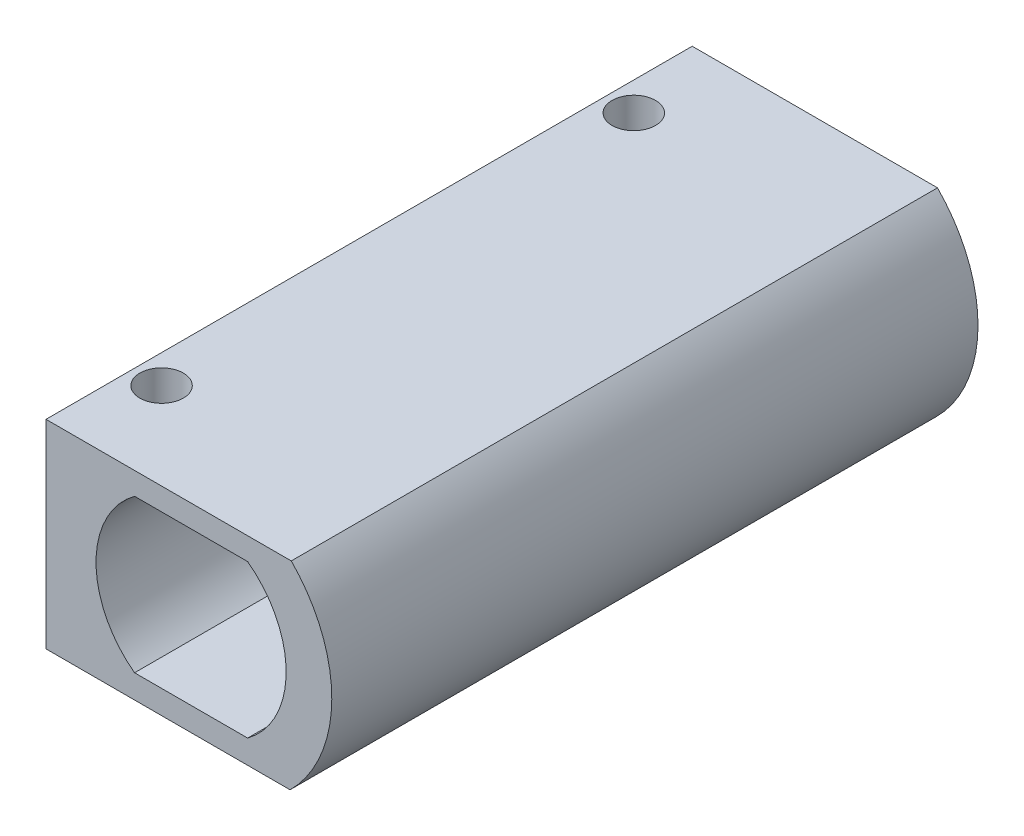
ISO-10303-21;
HEADER;
FILE_DESCRIPTION(('STEP AP214'),'2;1');
FILE_NAME('part.step','',(''),(''),'','','');
FILE_SCHEMA(('AUTOMOTIVE_DESIGN { 1 0 10303 214 1 1 1 1 }'));
ENDSEC;
DATA;
#1=APPLICATION_CONTEXT('core data for automotive mechanical design processes');
#2=APPLICATION_PROTOCOL_DEFINITION('international standard','automotive_design',2000,#1);
#3=PRODUCT_CONTEXT('',#1,'mechanical');
#4=PRODUCT('Part','Part','',(#3));
#5=PRODUCT_RELATED_PRODUCT_CATEGORY('part','',(#4));
#6=PRODUCT_DEFINITION_FORMATION('','',#4);
#7=PRODUCT_DEFINITION_CONTEXT('part definition',#1,'design');
#8=PRODUCT_DEFINITION('design','',#6,#7);
#9=PRODUCT_DEFINITION_SHAPE('','',#8);
#10=(LENGTH_UNIT() NAMED_UNIT(*) SI_UNIT(.MILLI.,.METRE.));
#11=(NAMED_UNIT(*) PLANE_ANGLE_UNIT() SI_UNIT($,.RADIAN.));
#12=(NAMED_UNIT(*) SI_UNIT($,.STERADIAN.) SOLID_ANGLE_UNIT());
#13=UNCERTAINTY_MEASURE_WITH_UNIT(LENGTH_MEASURE(1.E-05),#10,'distance_accuracy_value','');
#14=(GEOMETRIC_REPRESENTATION_CONTEXT(3) GLOBAL_UNCERTAINTY_ASSIGNED_CONTEXT((#13)) GLOBAL_UNIT_ASSIGNED_CONTEXT((#10,
#11,#12)) REPRESENTATION_CONTEXT('',''));
#15=CARTESIAN_POINT('',(0.,0.,0.));
#16=DIRECTION('',(0.,0.,1.));
#17=DIRECTION('',(1.,0.,0.));
#18=AXIS2_PLACEMENT_3D('',#15,#16,#17);
#19=CARTESIAN_POINT('',(0.,-0.291197411003233,52.));
#20=DIRECTION('',(0.,1.,0.));
#21=DIRECTION('',(-1.,0.,0.));
#22=AXIS2_PLACEMENT_3D('',#19,#20,#21);
#23=PLANE('',#22);
#24=CARTESIAN_POINT('',(-20.4679332061042,-0.291197411003231,7.));
#25=DIRECTION('',(0.,1.,0.));
#26=DIRECTION('',(-1.,0.,0.));
#27=AXIS2_PLACEMENT_3D('',#24,#25,#26);
#28=CIRCLE('',#27,1.75);
#29=CARTESIAN_POINT('',(-22.2179332061042,-0.291197411003232,7.));
#30=VERTEX_POINT('',#29);
#31=EDGE_CURVE('E184',#30,#30,#28,.T.);
#32=ORIENTED_EDGE('',*,*,#31,.T.);
#33=EDGE_LOOP('',(#32));
#34=FACE_BOUND('',#33,.T.);
#35=CARTESIAN_POINT('',(-20.4679332061042,-0.291197411003231,45.));
#36=DIRECTION('',(0.,1.,0.));
#37=DIRECTION('',(-1.,0.,0.));
#38=AXIS2_PLACEMENT_3D('',#35,#36,#37);
#39=CIRCLE('',#38,1.75);
#40=CARTESIAN_POINT('',(-22.2179332061042,-0.291197411003232,45.));
#41=VERTEX_POINT('',#40);
#42=EDGE_CURVE('E181',#41,#41,#39,.T.);
#43=ORIENTED_EDGE('',*,*,#42,.T.);
#44=EDGE_LOOP('',(#43));
#45=FACE_BOUND('',#44,.T.);
#46=DIRECTION('',(1.,0.,0.));
#47=VECTOR('',#46,1.);
#48=CARTESIAN_POINT('',(0.,-0.291197411003233,0.));
#49=LINE('',#48,#47);
#50=CARTESIAN_POINT('',(-22.7679332061042,-0.291197411003235,0.));
#51=VERTEX_POINT('',#50);
#52=CARTESIAN_POINT('',(-3.13212567747339,-0.291197411003234,0.));
#53=VERTEX_POINT('',#52);
#54=EDGE_CURVE('E232',#51,#53,#49,.T.);
#55=ORIENTED_EDGE('',*,*,#54,.T.);
#56=DIRECTION('',(0.,0.,-1.));
#57=VECTOR('',#56,1.);
#58=CARTESIAN_POINT('',(-3.13212567747339,-0.291197411003234,52.));
#59=LINE('',#58,#57);
#60=CARTESIAN_POINT('',(-3.13212567747339,-0.291197411003234,52.));
#61=VERTEX_POINT('',#60);
#62=EDGE_CURVE('E11',#61,#53,#59,.T.);
#63=ORIENTED_EDGE('',*,*,#62,.F.);
#64=DIRECTION('',(1.,0.,0.));
#65=VECTOR('',#64,1.);
#66=CARTESIAN_POINT('',(0.,-0.291197411003233,52.));
#67=LINE('',#66,#65);
#68=CARTESIAN_POINT('',(-22.7679332061042,-0.291197411003235,52.));
#69=VERTEX_POINT('',#68);
#70=EDGE_CURVE('E212',#69,#61,#67,.T.);
#71=ORIENTED_EDGE('',*,*,#70,.F.);
#72=DIRECTION('',(0.,0.,1.));
#73=VECTOR('',#72,1.);
#74=CARTESIAN_POINT('',(-22.7679332061042,-0.291197411003235,0.));
#75=LINE('',#74,#73);
#76=EDGE_CURVE('E194',#51,#69,#75,.T.);
#77=ORIENTED_EDGE('',*,*,#76,.F.);
#78=EDGE_LOOP('',(#55,#63,#71,#77));
#79=FACE_BOUND('',#78,.T.);
#80=ADVANCED_FACE('F43',(#34,#45,#79),#23,.F.);
#81=CARTESIAN_POINT('',(-11.0922513046228,7.75880258899676,52.));
#82=DIRECTION('',(0.,0.,-1.));
#83=DIRECTION('',(-1.,0.,0.));
#84=AXIS2_PLACEMENT_3D('',#81,#82,#83);
#85=CYLINDRICAL_SURFACE('',#84,11.32104677139);
#86=CARTESIAN_POINT('',(-11.0922513046228,7.75880258899676,0.));
#87=DIRECTION('',(0.,0.,1.));
#88=DIRECTION('',(1.,0.,0.));
#89=AXIS2_PLACEMENT_3D('',#86,#87,#88);
#90=CIRCLE('',#89,11.32104677139);
#91=CARTESIAN_POINT('',(-3.03225130462276,15.7088025889968,0.));
#92=VERTEX_POINT('',#91);
#93=EDGE_CURVE('E235',#53,#92,#90,.T.);
#94=ORIENTED_EDGE('',*,*,#93,.T.);
#95=DIRECTION('',(0.,0.,-1.));
#96=VECTOR('',#95,1.);
#97=CARTESIAN_POINT('',(-3.03225130462276,15.7088025889968,52.));
#98=LINE('',#97,#96);
#99=CARTESIAN_POINT('',(-3.03225130462276,15.7088025889968,52.));
#100=VERTEX_POINT('',#99);
#101=EDGE_CURVE('E57',#100,#92,#98,.T.);
#102=ORIENTED_EDGE('',*,*,#101,.F.);
#103=CARTESIAN_POINT('',(-11.0922513046228,7.75880258899676,52.));
#104=DIRECTION('',(0.,0.,1.));
#105=DIRECTION('',(1.,0.,0.));
#106=AXIS2_PLACEMENT_3D('',#103,#104,#105);
#107=CIRCLE('',#106,11.32104677139);
#108=EDGE_CURVE('E215',#61,#100,#107,.T.);
#109=ORIENTED_EDGE('',*,*,#108,.F.);
#110=ORIENTED_EDGE('',*,*,#62,.T.);
#111=EDGE_LOOP('',(#94,#102,#109,#110));
#112=FACE_BOUND('',#111,.T.);
#113=ADVANCED_FACE('F274',(#112),#85,.T.);
#114=CARTESIAN_POINT('',(0.,15.7088025889968,52.));
#115=DIRECTION('',(0.,1.,0.));
#116=DIRECTION('',(0.,0.,1.));
#117=AXIS2_PLACEMENT_3D('',#114,#115,#116);
#118=PLANE('',#117);
#119=CARTESIAN_POINT('',(-20.4679332061042,15.7088025889968,7.));
#120=DIRECTION('',(0.,1.,0.));
#121=DIRECTION('',(0.,0.,1.));
#122=AXIS2_PLACEMENT_3D('',#119,#120,#121);
#123=CIRCLE('',#122,1.75);
#124=CARTESIAN_POINT('',(-20.4679332061042,15.7088025889968,8.75));
#125=VERTEX_POINT('',#124);
#126=EDGE_CURVE('E175',#125,#125,#123,.T.);
#127=ORIENTED_EDGE('',*,*,#126,.F.);
#128=EDGE_LOOP('',(#127));
#129=FACE_BOUND('',#128,.T.);
#130=CARTESIAN_POINT('',(-20.4679332061042,15.7088025889968,45.));
#131=DIRECTION('',(0.,1.,0.));
#132=DIRECTION('',(0.,0.,1.));
#133=AXIS2_PLACEMENT_3D('',#130,#131,#132);
#134=CIRCLE('',#133,1.75);
#135=CARTESIAN_POINT('',(-20.4679332061042,15.7088025889968,46.75));
#136=VERTEX_POINT('',#135);
#137=EDGE_CURVE('E174',#136,#136,#134,.T.);
#138=ORIENTED_EDGE('',*,*,#137,.F.);
#139=EDGE_LOOP('',(#138));
#140=FACE_BOUND('',#139,.T.);
#141=DIRECTION('',(1.,0.,0.));
#142=VECTOR('',#141,1.);
#143=CARTESIAN_POINT('',(0.,15.7088025889968,0.));
#144=LINE('',#143,#142);
#145=CARTESIAN_POINT('',(-22.7679332061042,15.7088025889968,0.));
#146=VERTEX_POINT('',#145);
#147=EDGE_CURVE('E204',#146,#92,#144,.T.);
#148=ORIENTED_EDGE('',*,*,#147,.F.);
#149=DIRECTION('',(0.,0.,1.));
#150=VECTOR('',#149,1.);
#151=CARTESIAN_POINT('',(-22.7679332061042,15.7088025889968,0.));
#152=LINE('',#151,#150);
#153=CARTESIAN_POINT('',(-22.7679332061042,15.7088025889968,52.));
#154=VERTEX_POINT('',#153);
#155=EDGE_CURVE('E191',#146,#154,#152,.T.);
#156=ORIENTED_EDGE('',*,*,#155,.T.);
#157=DIRECTION('',(1.,0.,0.));
#158=VECTOR('',#157,1.);
#159=CARTESIAN_POINT('',(0.,15.7088025889968,52.));
#160=LINE('',#159,#158);
#161=EDGE_CURVE('E217',#154,#100,#160,.T.);
#162=ORIENTED_EDGE('',*,*,#161,.T.);
#163=ORIENTED_EDGE('',*,*,#101,.T.);
#164=EDGE_LOOP('',(#148,#156,#162,#163));
#165=FACE_BOUND('',#164,.T.);
#166=ADVANCED_FACE('F271',(#129,#140,#165),#118,.T.);
#167=CARTESIAN_POINT('',(-11.0922513046228,7.75880258899676,52.));
#168=DIRECTION('',(0.,0.,-1.));
#169=DIRECTION('',(-1.,0.,0.));
#170=AXIS2_PLACEMENT_3D('',#167,#168,#169);
#171=CYLINDRICAL_SURFACE('',#170,7.65);
#172=CARTESIAN_POINT('',(-11.0922513046228,7.75880258899676,22.5544976852205));
#173=DIRECTION('',(0.,0.,-1.));
#174=DIRECTION('',(-1.,0.,0.));
#175=AXIS2_PLACEMENT_3D('',#172,#173,#174);
#176=CIRCLE('',#175,7.65);
#177=CARTESIAN_POINT('',(-17.6113506230838,3.7558231890946,22.5544976852205));
#178=VERTEX_POINT('',#177);
#179=CARTESIAN_POINT('',(-17.671708106209,11.6617819888989,22.5544976852205));
#180=VERTEX_POINT('',#179);
#181=EDGE_CURVE('E172',#178,#180,#176,.T.);
#182=ORIENTED_EDGE('',*,*,#181,.F.);
#183=DIRECTION('',(0.,0.,-1.));
#184=VECTOR('',#183,1.);
#185=CARTESIAN_POINT('',(-17.6113506230838,3.7558231890946,52.));
#186=LINE('',#185,#184);
#187=CARTESIAN_POINT('',(-17.6113506230838,3.7558231890946,29.4455023147795));
#188=VERTEX_POINT('',#187);
#189=EDGE_CURVE('E165',#188,#178,#186,.T.);
#190=ORIENTED_EDGE('',*,*,#189,.F.);
#191=CARTESIAN_POINT('',(-11.0922513046228,7.75880258899676,29.4455023147795));
#192=DIRECTION('',(0.,0.,1.));
#193=DIRECTION('',(1.,0.,0.));
#194=AXIS2_PLACEMENT_3D('',#191,#192,#193);
#195=CIRCLE('',#194,7.65);
#196=CARTESIAN_POINT('',(-17.671708106209,11.6617819888989,29.4455023147795));
#197=VERTEX_POINT('',#196);
#198=EDGE_CURVE('E145',#197,#188,#195,.T.);
#199=ORIENTED_EDGE('',*,*,#198,.F.);
#200=DIRECTION('',(0.,0.,-1.));
#201=VECTOR('',#200,1.);
#202=CARTESIAN_POINT('',(-17.671708106209,11.6617819888989,52.));
#203=LINE('',#202,#201);
#204=EDGE_CURVE('E170',#180,#197,#203,.F.);
#205=ORIENTED_EDGE('',*,*,#204,.F.);
#206=EDGE_LOOP('',(#182,#190,#199,#205));
#207=FACE_BOUND('',#206,.T.);
#208=CARTESIAN_POINT('',(-18.7422513046228,7.75880258899676,7.29072663259404));
#209=CARTESIAN_POINT('',(-18.7422508235516,7.7035451910922,7.29072995775476));
#210=CARTESIAN_POINT('',(-18.7416491581108,7.64826949927101,7.28721585332469));
#211=CARTESIAN_POINT('',(-18.7392842668676,7.53887487218174,7.27263950478264));
#212=CARTESIAN_POINT('',(-18.7375247048767,7.48475284234855,7.2616010652045));
#213=CARTESIAN_POINT('',(-18.7335261145383,7.39129280662928,7.23343649150281));
#214=CARTESIAN_POINT('',(-18.7314885419666,7.35140269370844,7.21827797170989));
#215=CARTESIAN_POINT('',(-18.7281712141389,7.29447394650154,7.1892612478196));
#216=CARTESIAN_POINT('',(-18.7270146714149,7.27588570219278,7.17846354224178));
#217=CARTESIAN_POINT('',(-18.7246962959034,7.24054566319208,7.15419366294537));
#218=CARTESIAN_POINT('',(-18.723534505975,7.22378645654187,7.14073295652283));
#219=CARTESIAN_POINT('',(-18.7219279441133,7.20149832254525,7.11839216057848));
#220=CARTESIAN_POINT('',(-18.7214262677608,7.19468404371351,7.11080426176008));
#221=CARTESIAN_POINT('',(-18.7204840780485,7.18208409060865,7.09479487809404));
#222=CARTESIAN_POINT('',(-18.7200435806081,7.17629868394863,7.08637317725582));
#223=CARTESIAN_POINT('',(-18.7192548689163,7.16606018733244,7.06858646040805));
#224=CARTESIAN_POINT('',(-18.7189079215021,7.16162529104968,7.05921065551732));
#225=CARTESIAN_POINT('',(-18.7183585386615,7.15464941258528,7.03977610768324));
#226=CARTESIAN_POINT('',(-18.7181557668574,7.15210402136419,7.02971901476001));
#227=CARTESIAN_POINT('',(-18.717941005607,7.14941090520053,7.01045326928944));
#228=CARTESIAN_POINT('',(-18.7179098815241,7.14902266633743,7.00127880333472));
#229=CARTESIAN_POINT('',(-18.7179917009172,7.15004676294858,6.98303074056633));
#230=CARTESIAN_POINT('',(-18.7181046748281,7.15145947880264,6.97395716547018));
#231=CARTESIAN_POINT('',(-18.7184348401717,7.15562085987788,6.95739518249963));
#232=CARTESIAN_POINT('',(-18.7186364803528,7.15817078195374,6.94985459338261));
#233=CARTESIAN_POINT('',(-18.7191173606725,7.16430810131464,6.93521743196785));
#234=CARTESIAN_POINT('',(-18.7193966144406,7.16789568082484,6.92812093792503));
#235=CARTESIAN_POINT('',(-18.7202098154464,7.17846508190087,6.91005985521455));
#236=CARTESIAN_POINT('',(-18.7207926713075,7.18615309069047,6.89951177893871));
#237=CARTESIAN_POINT('',(-18.7220430207704,7.20305874313559,6.87972502349082));
#238=CARTESIAN_POINT('',(-18.7227107832752,7.21228127665731,6.87049071104757));
#239=CARTESIAN_POINT('',(-18.7245900334031,7.23900288672126,6.84674820111718));
#240=CARTESIAN_POINT('',(-18.7258361127496,7.2575509634795,6.83343357439453));
#241=CARTESIAN_POINT('',(-18.7282838377941,7.29631862823147,6.80957684188375));
#242=CARTESIAN_POINT('',(-18.7294853760816,7.3165419189403,6.79904110539681));
#243=CARTESIAN_POINT('',(-18.7328767153416,7.37802211164725,6.77100229644454));
#244=CARTESIAN_POINT('',(-18.7348981837551,7.42070201857968,6.75661805218809));
#245=CARTESIAN_POINT('',(-18.7382545334193,7.50768495017346,6.73385887706384));
#246=CARTESIAN_POINT('',(-18.7395865916606,7.55199386506832,6.72550859980183));
#247=CARTESIAN_POINT('',(-18.74200004773,7.66592244255171,6.71060298182596));
#248=CARTESIAN_POINT('',(-18.7425379283493,7.73602255238075,6.70757813274041));
#249=CARTESIAN_POINT('',(-18.7416761469294,7.87554700460282,6.71268393171672));
#250=CARTESIAN_POINT('',(-18.7402858943944,7.94497297547174,6.72076040239197));
#251=CARTESIAN_POINT('',(-18.7372695885388,8.03580367151214,6.74053249169898));
#252=CARTESIAN_POINT('',(-18.7364096168154,8.05855789672022,6.74628786467944));
#253=CARTESIAN_POINT('',(-18.7345090948896,8.1036267803862,6.75960945797244));
#254=CARTESIAN_POINT('',(-18.7334678946062,8.12593952284526,6.76718223582768));
#255=CARTESIAN_POINT('',(-18.7309228694172,8.17592102512651,6.78687628434692));
#256=CARTESIAN_POINT('',(-18.7293714307457,8.20332312210971,6.79967811340174));
#257=CARTESIAN_POINT('',(-18.7261557579226,8.25545609771886,6.82986432920823));
#258=CARTESIAN_POINT('',(-18.7244925335083,8.28020672329208,6.84721095519366));
#259=CARTESIAN_POINT('',(-18.7224141900987,8.30941370348319,6.87466237619527));
#260=CARTESIAN_POINT('',(-18.7219008890923,8.31646896077799,6.8819729689972));
#261=CARTESIAN_POINT('',(-18.7209255794352,8.32965427396382,6.89740982289116));
#262=CARTESIAN_POINT('',(-18.7204635985506,8.33578382965142,6.90553652104572));
#263=CARTESIAN_POINT('',(-18.7196189344293,8.34684546856081,6.9227221775414));
#264=CARTESIAN_POINT('',(-18.7192372308995,8.35176287068701,6.93179083747969));
#265=CARTESIAN_POINT('',(-18.7186031392566,8.35986372713454,6.95067698521199));
#266=CARTESIAN_POINT('',(-18.718350449178,8.36305123152016,6.96049266204855));
#267=CARTESIAN_POINT('',(-18.7180499859588,8.36682988461941,6.97832863979067));
#268=CARTESIAN_POINT('',(-18.7179690118873,8.36784240706803,6.98625920217));
#269=CARTESIAN_POINT('',(-18.7179165036855,8.36849959532244,7.00217691911702));
#270=CARTESIAN_POINT('',(-18.7179449286318,8.36814477261715,7.01016405140756));
#271=CARTESIAN_POINT('',(-18.7181077282979,8.36610379742815,7.02594243254106));
#272=CARTESIAN_POINT('',(-18.7182418580342,8.36442072331283,7.03373409138622));
#273=CARTESIAN_POINT('',(-18.7186016064315,8.35987349351982,7.04896059689941));
#274=CARTESIAN_POINT('',(-18.7188272983197,8.35700839247796,7.05639515263712));
#275=CARTESIAN_POINT('',(-18.7194667637915,8.34880902516634,7.07398058390434));
#276=CARTESIAN_POINT('',(-18.7199195817934,8.34294310134429,7.08388111578582));
#277=CARTESIAN_POINT('',(-18.7209199190977,8.32973118730993,7.10263132613988));
#278=CARTESIAN_POINT('',(-18.7214676732384,8.32238151923015,7.11147830470475));
#279=CARTESIAN_POINT('',(-18.7229884236879,8.30149866287213,7.13364421214158));
#280=CARTESIAN_POINT('',(-18.7240052603962,8.2870648436297,7.14610417358477));
#281=CARTESIAN_POINT('',(-18.7260561138995,8.25655964123937,7.16879777852722));
#282=CARTESIAN_POINT('',(-18.7270901703636,8.24048384865374,7.17902518289761));
#283=CARTESIAN_POINT('',(-18.7300543532593,8.191801935997,7.20643317239201));
#284=CARTESIAN_POINT('',(-18.7319164851962,8.15781758663519,7.22115256240754));
#285=CARTESIAN_POINT('',(-18.7352369938892,8.08819850030485,7.24578486000157));
#286=CARTESIAN_POINT('',(-18.7366945985897,8.05256075695505,7.25568860344896));
#287=CARTESIAN_POINT('',(-18.739332484732,7.9742747255126,7.27300238757578));
#288=CARTESIAN_POINT('',(-18.7404231927823,7.93146658577131,7.27969997810707));
#289=CARTESIAN_POINT('',(-18.741883030219,7.84537709980402,7.28856229958958));
#290=CARTESIAN_POINT('',(-18.7422516815307,7.80209545912678,7.29072402740891));
#291=CARTESIAN_POINT('',(-18.7422513046228,7.75880258899676,7.29072663259404));
#292=B_SPLINE_CURVE_WITH_KNOTS('',3,(#208,#209,#210,#211,#212,#213,#214,#215,#216,#217,#218,
#219,#220,#221,#222,#223,#224,#225,#226,#227,#228,#229,#230,#231,#232,#233,#234,#235,#236,#237,
#238,#239,#240,#241,#242,#243,#244,#245,#246,#247,#248,#249,#250,#251,#252,#253,#254,#255,#256,
#257,#258,#259,#260,#261,#262,#263,#264,#265,#266,#267,#268,#269,#270,#271,#272,#273,#274,#275,
#276,#277,#278,#279,#280,#281,#282,#283,#284,#285,#286,#287,#288,#289,#290,#291),.UNSPECIFIED.,
.T.,.F.,(4,2,2,2,2,2,2,2,2,2,2,2,2,2,2,2,2,2,2,2,2,2,2,2,2,2,2,2,2,2,2,2,2,2,2,2,2,2,2,2,2,4),
(0.,0.165679377061424,0.330837016733176,0.458252658857912,0.522691165308561,0.586858003376505,
0.617425363088036,0.648000661880687,0.678971290740523,0.709869422466892,0.737240747981685,
0.764617855554399,0.788416745328043,0.812219817013625,0.851189822065052,0.890286473245743,
0.958497873095702,1.0268642830441,1.16136339274464,1.29640897915226,1.50594237243678,
1.7144568097651,1.78486324503659,1.85552764404702,1.94614538995932,2.03603287608321,
2.0664935796103,2.09697068415559,2.12780054093678,2.15855790352527,2.18243281796012,
2.20629880226603,2.23010963639557,2.25393955103937,2.28829308769334,2.32273284833155,
2.37969441096661,2.43681317699972,2.54743810662305,2.6582727384969,2.78799277045413,
2.91779866118263),.UNSPECIFIED.);
#293=CARTESIAN_POINT('',(-18.7422513046228,7.75880258899676,7.29072663259404));
#294=VERTEX_POINT('',#293);
#295=EDGE_CURVE('E48',#294,#294,#292,.T.);
#296=ORIENTED_EDGE('',*,*,#295,.F.);
#297=EDGE_LOOP('',(#296));
#298=FACE_BOUND('',#297,.T.);
#299=CARTESIAN_POINT('',(-18.7422513046228,7.75880258899676,45.290726632594));
#300=CARTESIAN_POINT('',(-18.7422508235516,7.70354519109219,45.2907299577548));
#301=CARTESIAN_POINT('',(-18.7416491581108,7.64826949927101,45.2872158533247));
#302=CARTESIAN_POINT('',(-18.7392842668676,7.53887487218174,45.2726395047826));
#303=CARTESIAN_POINT('',(-18.7375247048767,7.48475284234854,45.2616010652045));
#304=CARTESIAN_POINT('',(-18.7335261145383,7.39129280662928,45.2334364915028));
#305=CARTESIAN_POINT('',(-18.7314885419666,7.35140269370844,45.2182779717099));
#306=CARTESIAN_POINT('',(-18.7281712141389,7.29447394650154,45.1892612478196));
#307=CARTESIAN_POINT('',(-18.7270146714149,7.27588570219278,45.1784635422418));
#308=CARTESIAN_POINT('',(-18.7246962959034,7.24054566319208,45.1541936629454));
#309=CARTESIAN_POINT('',(-18.723534505975,7.22378645654187,45.1407329565228));
#310=CARTESIAN_POINT('',(-18.7219279441133,7.20149832254526,45.1183921605785));
#311=CARTESIAN_POINT('',(-18.7214262677608,7.19468404371351,45.1108042617601));
#312=CARTESIAN_POINT('',(-18.7204840780485,7.18208409060865,45.094794878094));
#313=CARTESIAN_POINT('',(-18.7200435806081,7.17629868394863,45.0863731772558));
#314=CARTESIAN_POINT('',(-18.7192548689163,7.16606018733244,45.068586460408));
#315=CARTESIAN_POINT('',(-18.7189079215021,7.16162529104968,45.0592106555173));
#316=CARTESIAN_POINT('',(-18.7183585386615,7.15464941258528,45.0397761076832));
#317=CARTESIAN_POINT('',(-18.7181557668574,7.15210402136419,45.02971901476));
#318=CARTESIAN_POINT('',(-18.717941005607,7.14941090520054,45.0104532692894));
#319=CARTESIAN_POINT('',(-18.7179098815241,7.14902266633744,45.0012788033347));
#320=CARTESIAN_POINT('',(-18.7179917009172,7.15004676294858,44.9830307405663));
#321=CARTESIAN_POINT('',(-18.7181046748281,7.15145947880263,44.9739571654702));
#322=CARTESIAN_POINT('',(-18.7184348401717,7.15562085987787,44.9573951824996));
#323=CARTESIAN_POINT('',(-18.7186364803528,7.15817078195373,44.9498545933826));
#324=CARTESIAN_POINT('',(-18.7191173606725,7.16430810131463,44.9352174319678));
#325=CARTESIAN_POINT('',(-18.7193966144406,7.16789568082482,44.928120937925));
#326=CARTESIAN_POINT('',(-18.7202098154464,7.17846508190085,44.9100598552146));
#327=CARTESIAN_POINT('',(-18.7207926713075,7.18615309069045,44.8995117789387));
#328=CARTESIAN_POINT('',(-18.7220430207704,7.20305874313558,44.8797250234908));
#329=CARTESIAN_POINT('',(-18.7227107832752,7.21228127665731,44.8704907110476));
#330=CARTESIAN_POINT('',(-18.7245900334031,7.23900288672127,44.8467482011172));
#331=CARTESIAN_POINT('',(-18.7258361127496,7.25755096347951,44.8334335743945));
#332=CARTESIAN_POINT('',(-18.7282838377941,7.29631862823147,44.8095768418837));
#333=CARTESIAN_POINT('',(-18.7294853760816,7.3165419189403,44.7990411053968));
#334=CARTESIAN_POINT('',(-18.7328767153416,7.37802211164725,44.7710022964445));
#335=CARTESIAN_POINT('',(-18.7348981837551,7.42070201857968,44.7566180521881));
#336=CARTESIAN_POINT('',(-18.7382545334193,7.50768495017346,44.7338588770638));
#337=CARTESIAN_POINT('',(-18.7395865916606,7.55199386506832,44.7255085998018));
#338=CARTESIAN_POINT('',(-18.74200004773,7.66592244255172,44.710602981826));
#339=CARTESIAN_POINT('',(-18.7425379283493,7.73602255238075,44.7075781327404));
#340=CARTESIAN_POINT('',(-18.7416761469294,7.87554700460283,44.7126839317167));
#341=CARTESIAN_POINT('',(-18.7402858943944,7.94497297547175,44.720760402392));
#342=CARTESIAN_POINT('',(-18.7372695885388,8.03580367151215,44.740532491699));
#343=CARTESIAN_POINT('',(-18.7364096168154,8.05855789672023,44.7462878646794));
#344=CARTESIAN_POINT('',(-18.7345090948896,8.1036267803862,44.7596094579724));
#345=CARTESIAN_POINT('',(-18.7334678946062,8.12593952284527,44.7671822358277));
#346=CARTESIAN_POINT('',(-18.7309228694172,8.17592102512652,44.7868762843469));
#347=CARTESIAN_POINT('',(-18.7293714307457,8.2033231221097,44.7996781134017));
#348=CARTESIAN_POINT('',(-18.7261557579226,8.25545609771886,44.8298643292082));
#349=CARTESIAN_POINT('',(-18.7244925335083,8.28020672329209,44.8472109551936));
#350=CARTESIAN_POINT('',(-18.7224141900987,8.30941370348319,44.8746623761953));
#351=CARTESIAN_POINT('',(-18.7219008890923,8.31646896077797,44.8819729689972));
#352=CARTESIAN_POINT('',(-18.7209255794352,8.3296542739638,44.8974098228912));
#353=CARTESIAN_POINT('',(-18.7204635985506,8.3357838296514,44.9055365210457));
#354=CARTESIAN_POINT('',(-18.7196189344293,8.34684546856081,44.9227221775414));
#355=CARTESIAN_POINT('',(-18.7192372308995,8.35176287068701,44.9317908374797));
#356=CARTESIAN_POINT('',(-18.7186031392566,8.35986372713453,44.950676985212));
#357=CARTESIAN_POINT('',(-18.718350449178,8.36305123152015,44.9604926620485));
#358=CARTESIAN_POINT('',(-18.7180499859588,8.36682988461941,44.9783286397906));
#359=CARTESIAN_POINT('',(-18.7179690118873,8.36784240706803,44.98625920217));
#360=CARTESIAN_POINT('',(-18.7179165036855,8.36849959532245,45.002176919117));
#361=CARTESIAN_POINT('',(-18.7179449286318,8.36814477261716,45.0101640514075));
#362=CARTESIAN_POINT('',(-18.7181077282979,8.36610379742816,45.025942432541));
#363=CARTESIAN_POINT('',(-18.7182418580342,8.36442072331283,45.0337340913862));
#364=CARTESIAN_POINT('',(-18.7186016064315,8.35987349351982,45.0489605968994));
#365=CARTESIAN_POINT('',(-18.7188272983197,8.35700839247797,45.0563951526371));
#366=CARTESIAN_POINT('',(-18.7194667637914,8.34880902516637,45.0739805839043));
#367=CARTESIAN_POINT('',(-18.7199195817934,8.34294310134432,45.0838811157858));
#368=CARTESIAN_POINT('',(-18.7209199190977,8.32973118730996,45.1026313261399));
#369=CARTESIAN_POINT('',(-18.7214676732384,8.32238151923018,45.1114783047047));
#370=CARTESIAN_POINT('',(-18.7229884236879,8.30149866287217,45.1336442121415));
#371=CARTESIAN_POINT('',(-18.7240052603962,8.28706484362975,45.1461041735848));
#372=CARTESIAN_POINT('',(-18.7260561138995,8.25655964123944,45.1687977785272));
#373=CARTESIAN_POINT('',(-18.7270901703636,8.2404838486538,45.1790251828976));
#374=CARTESIAN_POINT('',(-18.7300543532593,8.19180193599708,45.206433172392));
#375=CARTESIAN_POINT('',(-18.7319164851962,8.15781758663529,45.2211525624075));
#376=CARTESIAN_POINT('',(-18.7352369938892,8.08819850030499,45.2457848600015));
#377=CARTESIAN_POINT('',(-18.7366945985897,8.0525607569552,45.2556886034489));
#378=CARTESIAN_POINT('',(-18.739332484732,7.97427472551274,45.2730023875758));
#379=CARTESIAN_POINT('',(-18.7404231927823,7.93146658577142,45.2796999781071));
#380=CARTESIAN_POINT('',(-18.741883030219,7.84537709980408,45.2885622995896));
#381=CARTESIAN_POINT('',(-18.7422516815307,7.8020954591268,45.2907240274089));
#382=CARTESIAN_POINT('',(-18.7422513046228,7.75880258899676,45.290726632594));
#383=B_SPLINE_CURVE_WITH_KNOTS('',3,(#299,#300,#301,#302,#303,#304,#305,#306,#307,#308,#309,
#310,#311,#312,#313,#314,#315,#316,#317,#318,#319,#320,#321,#322,#323,#324,#325,#326,#327,#328,
#329,#330,#331,#332,#333,#334,#335,#336,#337,#338,#339,#340,#341,#342,#343,#344,#345,#346,#347,
#348,#349,#350,#351,#352,#353,#354,#355,#356,#357,#358,#359,#360,#361,#362,#363,#364,#365,#366,
#367,#368,#369,#370,#371,#372,#373,#374,#375,#376,#377,#378,#379,#380,#381,#382),.UNSPECIFIED.,
.T.,.F.,(4,2,2,2,2,2,2,2,2,2,2,2,2,2,2,2,2,2,2,2,2,2,2,2,2,2,2,2,2,2,2,2,2,2,2,2,2,2,2,2,2,4),
(0.,0.165679377061428,0.330837016733184,0.458252658857913,0.522691165308563,0.5868580033765,
0.617425363088034,0.648000661880688,0.678971290740524,0.709869422466893,0.737240747981693,
0.764617855554396,0.788416745328045,0.812219817013623,0.851189822065058,0.890286473245755,
0.958497873095718,1.02686428304411,1.16136339274465,1.29640897915228,1.5059423724368,
1.71445680976512,1.78486324503661,1.85552764404704,1.94614538995934,2.03603287608321,
2.0664935796103,2.09697068415559,2.12780054093678,2.15855790352526,2.18243281796011,
2.20629880226603,2.23010963639557,2.25393955103936,2.28829308769333,2.32273284833153,
2.37969441096657,2.43681317699967,2.54743810662296,2.65827273849677,2.78799277045407,
2.91779866118266),.UNSPECIFIED.);
#384=CARTESIAN_POINT('',(-18.7422513046228,7.75880258899676,45.290726632594));
#385=VERTEX_POINT('',#384);
#386=EDGE_CURVE('E178',#385,#385,#383,.T.);
#387=ORIENTED_EDGE('',*,*,#386,.F.);
#388=EDGE_LOOP('',(#387));
#389=FACE_BOUND('',#388,.T.);
#390=CARTESIAN_POINT('',(-11.0922513046228,7.75880258899676,0.));
#391=DIRECTION('',(0.,0.,1.));
#392=DIRECTION('',(1.,0.,0.));
#393=AXIS2_PLACEMENT_3D('',#390,#391,#392);
#394=CIRCLE('',#393,7.65);
#395=CARTESIAN_POINT('',(-15.6419765710537,13.9088025889968,0.));
#396=VERTEX_POINT('',#395);
#397=CARTESIAN_POINT('',(-15.6419765710537,1.60880258899677,0.));
#398=VERTEX_POINT('',#397);
#399=EDGE_CURVE('E197',#396,#398,#394,.T.);
#400=ORIENTED_EDGE('',*,*,#399,.F.);
#401=DIRECTION('',(0.,0.,-1.));
#402=VECTOR('',#401,1.);
#403=CARTESIAN_POINT('',(-15.6419765710537,13.9088025889968,52.));
#404=LINE('',#403,#402);
#405=CARTESIAN_POINT('',(-15.6419765710537,13.9088025889968,52.));
#406=VERTEX_POINT('',#405);
#407=EDGE_CURVE('E240',#406,#396,#404,.T.);
#408=ORIENTED_EDGE('',*,*,#407,.F.);
#409=CARTESIAN_POINT('',(-11.0922513046228,7.75880258899676,52.));
#410=DIRECTION('',(0.,0.,1.));
#411=DIRECTION('',(1.,0.,0.));
#412=AXIS2_PLACEMENT_3D('',#409,#410,#411);
#413=CIRCLE('',#412,7.65);
#414=CARTESIAN_POINT('',(-15.6419765710537,1.60880258899677,52.));
#415=VERTEX_POINT('',#414);
#416=EDGE_CURVE('E200',#406,#415,#413,.T.);
#417=ORIENTED_EDGE('',*,*,#416,.T.);
#418=DIRECTION('',(0.,0.,-1.));
#419=VECTOR('',#418,1.);
#420=CARTESIAN_POINT('',(-15.6419765710537,1.60880258899677,52.));
#421=LINE('',#420,#419);
#422=EDGE_CURVE('E220',#415,#398,#421,.T.);
#423=ORIENTED_EDGE('',*,*,#422,.T.);
#424=EDGE_LOOP('',(#400,#408,#417,#423));
#425=FACE_BOUND('',#424,.T.);
#426=ADVANCED_FACE('F45',(#207,#298,#389,#425),#171,.F.);
#427=CARTESIAN_POINT('',(0.,13.9088025889968,52.));
#428=DIRECTION('',(0.,-1.,0.));
#429=DIRECTION('',(0.,0.,-1.));
#430=AXIS2_PLACEMENT_3D('',#427,#428,#429);
#431=PLANE('',#430);
#432=DIRECTION('',(-1.,0.,0.));
#433=VECTOR('',#432,1.);
#434=CARTESIAN_POINT('',(0.,13.9088025889968,0.));
#435=LINE('',#434,#433);
#436=CARTESIAN_POINT('',(-6.54252603819184,13.9088025889968,0.));
#437=VERTEX_POINT('',#436);
#438=EDGE_CURVE('E223',#437,#396,#435,.T.);
#439=ORIENTED_EDGE('',*,*,#438,.F.);
#440=DIRECTION('',(0.,0.,-1.));
#441=VECTOR('',#440,1.);
#442=CARTESIAN_POINT('',(-6.54252603819184,13.9088025889968,52.));
#443=LINE('',#442,#441);
#444=CARTESIAN_POINT('',(-6.54252603819184,13.9088025889968,52.));
#445=VERTEX_POINT('',#444);
#446=EDGE_CURVE('E245',#445,#437,#443,.T.);
#447=ORIENTED_EDGE('',*,*,#446,.F.);
#448=DIRECTION('',(-1.,0.,0.));
#449=VECTOR('',#448,1.);
#450=CARTESIAN_POINT('',(0.,13.9088025889968,52.));
#451=LINE('',#450,#449);
#452=EDGE_CURVE('E203',#445,#406,#451,.T.);
#453=ORIENTED_EDGE('',*,*,#452,.T.);
#454=ORIENTED_EDGE('',*,*,#407,.T.);
#455=EDGE_LOOP('',(#439,#447,#453,#454));
#456=FACE_BOUND('',#455,.T.);
#457=ADVANCED_FACE('F287',(#456),#431,.T.);
#458=CARTESIAN_POINT('',(-11.0922513046228,7.75880258899676,52.));
#459=DIRECTION('',(0.,0.,-1.));
#460=DIRECTION('',(-1.,0.,0.));
#461=AXIS2_PLACEMENT_3D('',#458,#459,#460);
#462=CYLINDRICAL_SURFACE('',#461,7.65);
#463=CARTESIAN_POINT('',(-11.0922513046228,7.75880258899676,0.));
#464=DIRECTION('',(0.,0.,1.));
#465=DIRECTION('',(1.,0.,0.));
#466=AXIS2_PLACEMENT_3D('',#463,#464,#465);
#467=CIRCLE('',#466,7.65);
#468=CARTESIAN_POINT('',(-6.54252603819183,1.60880258899677,0.));
#469=VERTEX_POINT('',#468);
#470=EDGE_CURVE('E226',#469,#437,#467,.T.);
#471=ORIENTED_EDGE('',*,*,#470,.F.);
#472=DIRECTION('',(0.,0.,-1.));
#473=VECTOR('',#472,1.);
#474=CARTESIAN_POINT('',(-6.54252603819183,1.60880258899677,52.));
#475=LINE('',#474,#473);
#476=CARTESIAN_POINT('',(-6.54252603819183,1.60880258899677,52.));
#477=VERTEX_POINT('',#476);
#478=EDGE_CURVE('E243',#477,#469,#475,.T.);
#479=ORIENTED_EDGE('',*,*,#478,.F.);
#480=CARTESIAN_POINT('',(-11.0922513046228,7.75880258899676,52.));
#481=DIRECTION('',(0.,0.,1.));
#482=DIRECTION('',(1.,0.,0.));
#483=AXIS2_PLACEMENT_3D('',#480,#481,#482);
#484=CIRCLE('',#483,7.65);
#485=EDGE_CURVE('E207',#477,#445,#484,.T.);
#486=ORIENTED_EDGE('',*,*,#485,.T.);
#487=ORIENTED_EDGE('',*,*,#446,.T.);
#488=EDGE_LOOP('',(#471,#479,#486,#487));
#489=FACE_BOUND('',#488,.T.);
#490=ADVANCED_FACE('F284',(#489),#462,.F.);
#491=CARTESIAN_POINT('',(0.,1.60880258899677,52.));
#492=DIRECTION('',(0.,-1.,0.));
#493=DIRECTION('',(1.,0.,0.));
#494=AXIS2_PLACEMENT_3D('',#491,#492,#493);
#495=PLANE('',#494);
#496=DIRECTION('',(-1.,0.,0.));
#497=VECTOR('',#496,1.);
#498=CARTESIAN_POINT('',(0.,1.60880258899677,0.));
#499=LINE('',#498,#497);
#500=EDGE_CURVE('E229',#469,#398,#499,.T.);
#501=ORIENTED_EDGE('',*,*,#500,.T.);
#502=ORIENTED_EDGE('',*,*,#422,.F.);
#503=DIRECTION('',(-1.,0.,0.));
#504=VECTOR('',#503,1.);
#505=CARTESIAN_POINT('',(0.,1.60880258899677,52.));
#506=LINE('',#505,#504);
#507=EDGE_CURVE('E210',#477,#415,#506,.T.);
#508=ORIENTED_EDGE('',*,*,#507,.F.);
#509=ORIENTED_EDGE('',*,*,#478,.T.);
#510=EDGE_LOOP('',(#501,#502,#508,#509));
#511=FACE_BOUND('',#510,.T.);
#512=ADVANCED_FACE('F266',(#511),#495,.F.);
#513=CARTESIAN_POINT('',(0.,0.,52.));
#514=DIRECTION('',(0.,0.,1.));
#515=DIRECTION('',(1.,0.,0.));
#516=AXIS2_PLACEMENT_3D('',#513,#514,#515);
#517=PLANE('',#516);
#518=ORIENTED_EDGE('',*,*,#416,.F.);
#519=ORIENTED_EDGE('',*,*,#452,.F.);
#520=ORIENTED_EDGE('',*,*,#485,.F.);
#521=ORIENTED_EDGE('',*,*,#507,.T.);
#522=EDGE_LOOP('',(#518,#519,#520,#521));
#523=FACE_BOUND('',#522,.T.);
#524=ORIENTED_EDGE('',*,*,#70,.T.);
#525=ORIENTED_EDGE('',*,*,#108,.T.);
#526=ORIENTED_EDGE('',*,*,#161,.F.);
#527=DIRECTION('',(0.,-1.,0.));
#528=VECTOR('',#527,1.);
#529=CARTESIAN_POINT('',(-22.7679332061042,15.7088025889968,52.));
#530=LINE('',#529,#528);
#531=EDGE_CURVE('E187',#154,#69,#530,.T.);
#532=ORIENTED_EDGE('',*,*,#531,.T.);
#533=EDGE_LOOP('',(#524,#525,#526,#532));
#534=FACE_BOUND('',#533,.T.);
#535=ADVANCED_FACE('F263',(#523,#534),#517,.T.);
#536=CARTESIAN_POINT('',(0.,0.,0.));
#537=DIRECTION('',(0.,0.,1.));
#538=DIRECTION('',(1.,0.,0.));
#539=AXIS2_PLACEMENT_3D('',#536,#537,#538);
#540=PLANE('',#539);
#541=ORIENTED_EDGE('',*,*,#399,.T.);
#542=ORIENTED_EDGE('',*,*,#500,.F.);
#543=ORIENTED_EDGE('',*,*,#470,.T.);
#544=ORIENTED_EDGE('',*,*,#438,.T.);
#545=EDGE_LOOP('',(#541,#542,#543,#544));
#546=FACE_BOUND('',#545,.T.);
#547=ORIENTED_EDGE('',*,*,#54,.F.);
#548=DIRECTION('',(0.,-1.,0.));
#549=VECTOR('',#548,1.);
#550=CARTESIAN_POINT('',(-22.7679332061042,15.7088025889968,0.));
#551=LINE('',#550,#549);
#552=EDGE_CURVE('E188',#146,#51,#551,.T.);
#553=ORIENTED_EDGE('',*,*,#552,.F.);
#554=ORIENTED_EDGE('',*,*,#147,.T.);
#555=ORIENTED_EDGE('',*,*,#93,.F.);
#556=EDGE_LOOP('',(#547,#553,#554,#555));
#557=FACE_BOUND('',#556,.T.);
#558=ADVANCED_FACE('F262',(#546,#557),#540,.F.);
#559=CARTESIAN_POINT('',(-22.7679332061042,15.7088025889968,0.));
#560=DIRECTION('',(-1.,0.,0.));
#561=DIRECTION('',(0.,0.,1.));
#562=AXIS2_PLACEMENT_3D('',#559,#560,#561);
#563=PLANE('',#562);
#564=DIRECTION('',(0.,-1.,0.));
#565=VECTOR('',#564,1.);
#566=CARTESIAN_POINT('',(-22.7679332061042,3.7558231890946,22.5544976852205));
#567=LINE('',#566,#565);
#568=CARTESIAN_POINT('',(-22.7679332061042,11.6617819888989,22.5544976852205));
#569=VERTEX_POINT('',#568);
#570=CARTESIAN_POINT('',(-22.7679332061042,3.7558231890946,22.5544976852205));
#571=VERTEX_POINT('',#570);
#572=EDGE_CURVE('E73',#569,#571,#567,.T.);
#573=ORIENTED_EDGE('',*,*,#572,.F.);
#574=DIRECTION('',(0.,0.,-1.));
#575=VECTOR('',#574,1.);
#576=CARTESIAN_POINT('',(-22.7679332061042,11.6617819888989,29.4455023147795));
#577=LINE('',#576,#575);
#578=CARTESIAN_POINT('',(-22.7679332061042,11.6617819888989,29.4455023147795));
#579=VERTEX_POINT('',#578);
#580=EDGE_CURVE('E158',#579,#569,#577,.T.);
#581=ORIENTED_EDGE('',*,*,#580,.F.);
#582=DIRECTION('',(0.,1.,0.));
#583=VECTOR('',#582,1.);
#584=CARTESIAN_POINT('',(-22.7679332061042,3.7558231890946,29.4455023147795));
#585=LINE('',#584,#583);
#586=CARTESIAN_POINT('',(-22.7679332061042,3.7558231890946,29.4455023147795));
#587=VERTEX_POINT('',#586);
#588=EDGE_CURVE('E142',#587,#579,#585,.T.);
#589=ORIENTED_EDGE('',*,*,#588,.F.);
#590=DIRECTION('',(0.,0.,1.));
#591=VECTOR('',#590,1.);
#592=CARTESIAN_POINT('',(-22.7679332061042,3.7558231890946,29.4455023147795));
#593=LINE('',#592,#591);
#594=EDGE_CURVE('E151',#571,#587,#593,.T.);
#595=ORIENTED_EDGE('',*,*,#594,.F.);
#596=EDGE_LOOP('',(#573,#581,#589,#595));
#597=FACE_BOUND('',#596,.T.);
#598=ORIENTED_EDGE('',*,*,#531,.F.);
#599=ORIENTED_EDGE('',*,*,#155,.F.);
#600=ORIENTED_EDGE('',*,*,#552,.T.);
#601=ORIENTED_EDGE('',*,*,#76,.T.);
#602=EDGE_LOOP('',(#598,#599,#600,#601));
#603=FACE_BOUND('',#602,.T.);
#604=ADVANCED_FACE('F155',(#597,#603),#563,.T.);
#605=CARTESIAN_POINT('',(-20.4679332061042,-36.2911974110032,45.));
#606=DIRECTION('',(0.,1.,0.));
#607=DIRECTION('',(0.,0.,1.));
#608=AXIS2_PLACEMENT_3D('',#605,#606,#607);
#609=CYLINDRICAL_SURFACE('',#608,1.75);
#610=ORIENTED_EDGE('',*,*,#137,.T.);
#611=EDGE_LOOP('',(#610));
#612=FACE_BOUND('',#611,.T.);
#613=ORIENTED_EDGE('',*,*,#386,.T.);
#614=EDGE_LOOP('',(#613));
#615=FACE_BOUND('',#614,.T.);
#616=ORIENTED_EDGE('',*,*,#42,.F.);
#617=EDGE_LOOP('',(#616));
#618=FACE_BOUND('',#617,.T.);
#619=ADVANCED_FACE('F252',(#612,#615,#618),#609,.F.);
#620=CARTESIAN_POINT('',(-20.4679332061042,-36.2911974110032,7.));
#621=DIRECTION('',(0.,1.,0.));
#622=DIRECTION('',(0.,0.,1.));
#623=AXIS2_PLACEMENT_3D('',#620,#621,#622);
#624=CYLINDRICAL_SURFACE('',#623,1.75);
#625=ORIENTED_EDGE('',*,*,#126,.T.);
#626=EDGE_LOOP('',(#625));
#627=FACE_BOUND('',#626,.T.);
#628=ORIENTED_EDGE('',*,*,#295,.T.);
#629=EDGE_LOOP('',(#628));
#630=FACE_BOUND('',#629,.T.);
#631=ORIENTED_EDGE('',*,*,#31,.F.);
#632=EDGE_LOOP('',(#631));
#633=FACE_BOUND('',#632,.T.);
#634=ADVANCED_FACE('F256',(#627,#630,#633),#624,.F.);
#635=CARTESIAN_POINT('',(-12.7679332061042,3.7558231890946,22.5544976852205));
#636=DIRECTION('',(0.,0.,-1.));
#637=DIRECTION('',(-1.,0.,0.));
#638=AXIS2_PLACEMENT_3D('',#635,#636,#637);
#639=PLANE('',#638);
#640=ORIENTED_EDGE('',*,*,#181,.T.);
#641=DIRECTION('',(-1.,0.,0.));
#642=VECTOR('',#641,1.);
#643=CARTESIAN_POINT('',(-12.7679332061042,11.6617819888989,22.5544976852205));
#644=LINE('',#643,#642);
#645=EDGE_CURVE('E163',#180,#569,#644,.T.);
#646=ORIENTED_EDGE('',*,*,#645,.T.);
#647=ORIENTED_EDGE('',*,*,#572,.T.);
#648=DIRECTION('',(-1.,0.,0.));
#649=VECTOR('',#648,1.);
#650=CARTESIAN_POINT('',(-12.7679332061042,3.7558231890946,22.5544976852205));
#651=LINE('',#650,#649);
#652=EDGE_CURVE('E148',#178,#571,#651,.T.);
#653=ORIENTED_EDGE('',*,*,#652,.F.);
#654=EDGE_LOOP('',(#640,#646,#647,#653));
#655=FACE_BOUND('',#654,.T.);
#656=ADVANCED_FACE('F331',(#655),#639,.F.);
#657=CARTESIAN_POINT('',(-12.7679332061042,11.6617819888989,29.4455023147795));
#658=DIRECTION('',(0.,1.,0.));
#659=DIRECTION('',(0.,0.,1.));
#660=AXIS2_PLACEMENT_3D('',#657,#658,#659);
#661=PLANE('',#660);
#662=ORIENTED_EDGE('',*,*,#204,.T.);
#663=DIRECTION('',(-1.,0.,0.));
#664=VECTOR('',#663,1.);
#665=CARTESIAN_POINT('',(-12.7679332061042,11.6617819888989,29.4455023147795));
#666=LINE('',#665,#664);
#667=EDGE_CURVE('E147',#197,#579,#666,.T.);
#668=ORIENTED_EDGE('',*,*,#667,.T.);
#669=ORIENTED_EDGE('',*,*,#580,.T.);
#670=ORIENTED_EDGE('',*,*,#645,.F.);
#671=EDGE_LOOP('',(#662,#668,#669,#670));
#672=FACE_BOUND('',#671,.T.);
#673=ADVANCED_FACE('F337',(#672),#661,.F.);
#674=CARTESIAN_POINT('',(-12.7679332061042,3.7558231890946,29.4455023147795));
#675=DIRECTION('',(0.,0.,1.));
#676=DIRECTION('',(1.,0.,0.));
#677=AXIS2_PLACEMENT_3D('',#674,#675,#676);
#678=PLANE('',#677);
#679=ORIENTED_EDGE('',*,*,#198,.T.);
#680=DIRECTION('',(-1.,0.,0.));
#681=VECTOR('',#680,1.);
#682=CARTESIAN_POINT('',(-12.7679332061042,3.7558231890946,29.4455023147795));
#683=LINE('',#682,#681);
#684=EDGE_CURVE('E65',#188,#587,#683,.T.);
#685=ORIENTED_EDGE('',*,*,#684,.T.);
#686=ORIENTED_EDGE('',*,*,#588,.T.);
#687=ORIENTED_EDGE('',*,*,#667,.F.);
#688=EDGE_LOOP('',(#679,#685,#686,#687));
#689=FACE_BOUND('',#688,.T.);
#690=ADVANCED_FACE('F139',(#689),#678,.F.);
#691=CARTESIAN_POINT('',(-12.7679332061042,3.7558231890946,29.4455023147795));
#692=DIRECTION('',(0.,-1.,0.));
#693=DIRECTION('',(0.,0.,-1.));
#694=AXIS2_PLACEMENT_3D('',#691,#692,#693);
#695=PLANE('',#694);
#696=ORIENTED_EDGE('',*,*,#189,.T.);
#697=ORIENTED_EDGE('',*,*,#652,.T.);
#698=ORIENTED_EDGE('',*,*,#594,.T.);
#699=ORIENTED_EDGE('',*,*,#684,.F.);
#700=EDGE_LOOP('',(#696,#697,#698,#699));
#701=FACE_BOUND('',#700,.T.);
#702=ADVANCED_FACE('F152',(#701),#695,.F.);
#703=CLOSED_SHELL('',(#80,#113,#166,#426,#457,#490,#512,#535,#558,#604,#619,#634,#656,#673,#690,#702));
#704=MANIFOLD_SOLID_BREP('B2',#703);
#705=ADVANCED_BREP_SHAPE_REPRESENTATION('',(#18,#704),#14);
#706=SHAPE_DEFINITION_REPRESENTATION(#9,#705);
ENDSEC;
END-ISO-10303-21;
